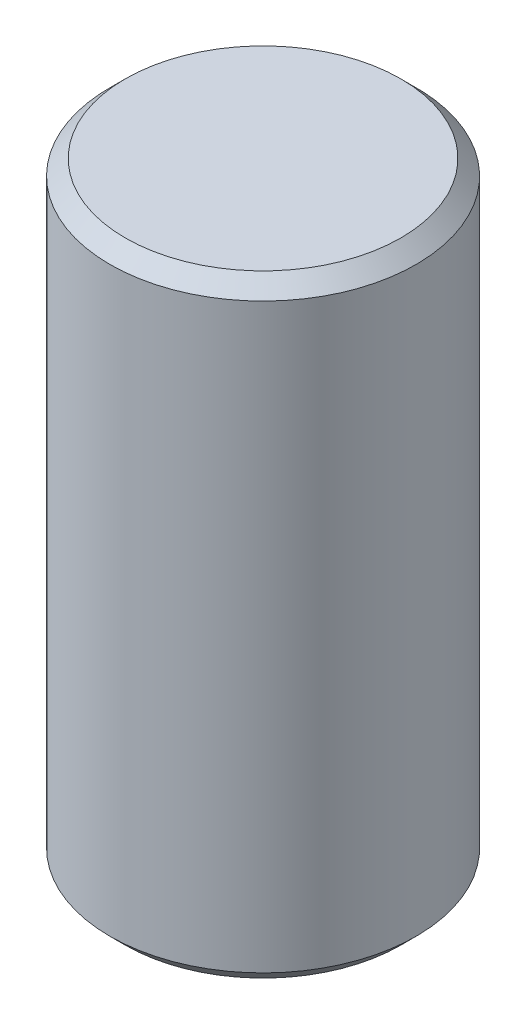
ISO-10303-21;
HEADER;
FILE_DESCRIPTION(('STEP AP214'),'2;1');
FILE_NAME('part.step','',(''),(''),'','','');
FILE_SCHEMA(('AUTOMOTIVE_DESIGN { 1 0 10303 214 1 1 1 1 }'));
ENDSEC;
DATA;
#1=APPLICATION_CONTEXT('core data for automotive mechanical design processes');
#2=APPLICATION_PROTOCOL_DEFINITION('international standard','automotive_design',2000,#1);
#3=PRODUCT_CONTEXT('',#1,'mechanical');
#4=PRODUCT('Part','Part','',(#3));
#5=PRODUCT_RELATED_PRODUCT_CATEGORY('part','',(#4));
#6=PRODUCT_DEFINITION_FORMATION('','',#4);
#7=PRODUCT_DEFINITION_CONTEXT('part definition',#1,'design');
#8=PRODUCT_DEFINITION('design','',#6,#7);
#9=PRODUCT_DEFINITION_SHAPE('','',#8);
#10=(LENGTH_UNIT() NAMED_UNIT(*) SI_UNIT(.MILLI.,.METRE.));
#11=(NAMED_UNIT(*) PLANE_ANGLE_UNIT() SI_UNIT($,.RADIAN.));
#12=(NAMED_UNIT(*) SI_UNIT($,.STERADIAN.) SOLID_ANGLE_UNIT());
#13=UNCERTAINTY_MEASURE_WITH_UNIT(LENGTH_MEASURE(1.E-05),#10,'distance_accuracy_value','');
#14=(GEOMETRIC_REPRESENTATION_CONTEXT(3) GLOBAL_UNCERTAINTY_ASSIGNED_CONTEXT((#13)) GLOBAL_UNIT_ASSIGNED_CONTEXT((#10,
#11,#12)) REPRESENTATION_CONTEXT('',''));
#15=CARTESIAN_POINT('',(0.,0.,0.));
#16=DIRECTION('',(0.,0.,1.));
#17=DIRECTION('',(1.,0.,0.));
#18=AXIS2_PLACEMENT_3D('',#15,#16,#17);
#19=CARTESIAN_POINT('',(0.,10.,0.));
#20=DIRECTION('',(0.,-1.,0.));
#21=DIRECTION('',(0.,0.,-1.));
#22=AXIS2_PLACEMENT_3D('',#19,#20,#21);
#23=CYLINDRICAL_SURFACE('',#22,2.5);
#24=CARTESIAN_POINT('',(0.,0.25,0.));
#25=DIRECTION('',(0.,1.,0.));
#26=DIRECTION('',(0.,0.,1.));
#27=AXIS2_PLACEMENT_3D('',#24,#25,#26);
#28=CIRCLE('',#27,2.5);
#29=CARTESIAN_POINT('',(0.,0.25,2.5));
#30=VERTEX_POINT('',#29);
#31=EDGE_CURVE('E49',#30,#30,#28,.T.);
#32=ORIENTED_EDGE('',*,*,#31,.T.);
#33=EDGE_LOOP('',(#32));
#34=FACE_BOUND('',#33,.T.);
#35=CARTESIAN_POINT('',(0.,9.75,0.));
#36=DIRECTION('',(0.,1.,0.));
#37=DIRECTION('',(0.,0.,1.));
#38=AXIS2_PLACEMENT_3D('',#35,#36,#37);
#39=CIRCLE('',#38,2.5);
#40=CARTESIAN_POINT('',(0.,9.75,2.5));
#41=VERTEX_POINT('',#40);
#42=EDGE_CURVE('E53',#41,#41,#39,.F.);
#43=ORIENTED_EDGE('',*,*,#42,.T.);
#44=EDGE_LOOP('',(#43));
#45=FACE_BOUND('',#44,.T.);
#46=ADVANCED_FACE('F37',(#34,#45),#23,.T.);
#47=CARTESIAN_POINT('',(0.,10.,0.));
#48=DIRECTION('',(0.,1.,0.));
#49=DIRECTION('',(0.,0.,1.));
#50=AXIS2_PLACEMENT_3D('',#47,#48,#49);
#51=PLANE('',#50);
#52=CARTESIAN_POINT('',(0.,10.,0.));
#53=DIRECTION('',(0.,1.,0.));
#54=DIRECTION('',(0.,0.,1.));
#55=AXIS2_PLACEMENT_3D('',#52,#53,#54);
#56=CIRCLE('',#55,2.25);
#57=CARTESIAN_POINT('',(0.,10.,2.25));
#58=VERTEX_POINT('',#57);
#59=EDGE_CURVE('E10',#58,#58,#56,.T.);
#60=ORIENTED_EDGE('',*,*,#59,.T.);
#61=EDGE_LOOP('',(#60));
#62=FACE_BOUND('',#61,.T.);
#63=ADVANCED_FACE('F69',(#62),#51,.T.);
#64=CARTESIAN_POINT('',(0.,0.,0.));
#65=DIRECTION('',(0.,1.,0.));
#66=DIRECTION('',(0.,0.,1.));
#67=AXIS2_PLACEMENT_3D('',#64,#65,#66);
#68=PLANE('',#67);
#69=CARTESIAN_POINT('',(0.,0.,0.));
#70=DIRECTION('',(0.,1.,0.));
#71=DIRECTION('',(0.,0.,1.));
#72=AXIS2_PLACEMENT_3D('',#69,#70,#71);
#73=CIRCLE('',#72,2.25);
#74=CARTESIAN_POINT('',(0.,0.,2.25));
#75=VERTEX_POINT('',#74);
#76=EDGE_CURVE('E45',#75,#75,#73,.F.);
#77=ORIENTED_EDGE('',*,*,#76,.T.);
#78=EDGE_LOOP('',(#77));
#79=FACE_BOUND('',#78,.T.);
#80=ADVANCED_FACE('F66',(#79),#68,.F.);
#81=CARTESIAN_POINT('',(0.,0.25,0.));
#82=DIRECTION('',(0.,1.,0.));
#83=DIRECTION('',(0.,0.,1.));
#84=AXIS2_PLACEMENT_3D('',#81,#82,#83);
#85=CONICAL_SURFACE('',#84,2.5,0.785398163397449);
#86=ORIENTED_EDGE('',*,*,#76,.F.);
#87=EDGE_LOOP('',(#86));
#88=FACE_BOUND('',#87,.T.);
#89=ORIENTED_EDGE('',*,*,#31,.F.);
#90=EDGE_LOOP('',(#89));
#91=FACE_BOUND('',#90,.T.);
#92=ADVANCED_FACE('F62',(#88,#91),#85,.T.);
#93=CARTESIAN_POINT('',(0.,10.,0.));
#94=DIRECTION('',(0.,-1.,0.));
#95=DIRECTION('',(0.,0.,-1.));
#96=AXIS2_PLACEMENT_3D('',#93,#94,#95);
#97=CONICAL_SURFACE('',#96,2.25,0.785398163397444);
#98=ORIENTED_EDGE('',*,*,#42,.F.);
#99=EDGE_LOOP('',(#98));
#100=FACE_BOUND('',#99,.T.);
#101=ORIENTED_EDGE('',*,*,#59,.F.);
#102=EDGE_LOOP('',(#101));
#103=FACE_BOUND('',#102,.T.);
#104=ADVANCED_FACE('F40',(#100,#103),#97,.T.);
#105=CLOSED_SHELL('',(#46,#63,#80,#92,#104));
#106=MANIFOLD_SOLID_BREP('B2',#105);
#107=ADVANCED_BREP_SHAPE_REPRESENTATION('',(#18,#106),#14);
#108=SHAPE_DEFINITION_REPRESENTATION(#9,#107);
ENDSEC;
END-ISO-10303-21;
